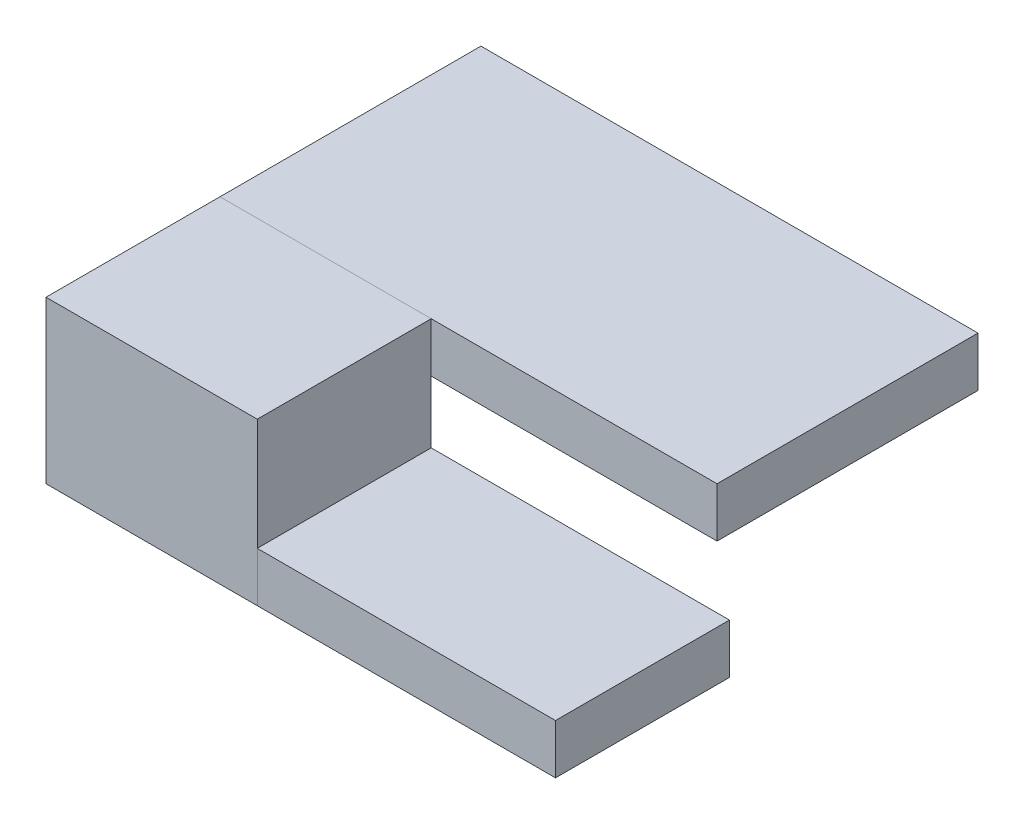
ISO-10303-21;
HEADER;
FILE_DESCRIPTION(('STEP AP214'),'2;1');
FILE_NAME('part.step','',(''),(''),'','','');
FILE_SCHEMA(('AUTOMOTIVE_DESIGN { 1 0 10303 214 1 1 1 1 }'));
ENDSEC;
DATA;
#1=APPLICATION_CONTEXT('core data for automotive mechanical design processes');
#2=APPLICATION_PROTOCOL_DEFINITION('international standard','automotive_design',2000,#1);
#3=PRODUCT_CONTEXT('',#1,'mechanical');
#4=PRODUCT('Part','Part','',(#3));
#5=PRODUCT_RELATED_PRODUCT_CATEGORY('part','',(#4));
#6=PRODUCT_DEFINITION_FORMATION('','',#4);
#7=PRODUCT_DEFINITION_CONTEXT('part definition',#1,'design');
#8=PRODUCT_DEFINITION('design','',#6,#7);
#9=PRODUCT_DEFINITION_SHAPE('','',#8);
#10=(LENGTH_UNIT() NAMED_UNIT(*) SI_UNIT(.MILLI.,.METRE.));
#11=(NAMED_UNIT(*) PLANE_ANGLE_UNIT() SI_UNIT($,.RADIAN.));
#12=(NAMED_UNIT(*) SI_UNIT($,.STERADIAN.) SOLID_ANGLE_UNIT());
#13=UNCERTAINTY_MEASURE_WITH_UNIT(LENGTH_MEASURE(1.E-05),#10,'distance_accuracy_value','');
#14=(GEOMETRIC_REPRESENTATION_CONTEXT(3) GLOBAL_UNCERTAINTY_ASSIGNED_CONTEXT((#13)) GLOBAL_UNIT_ASSIGNED_CONTEXT((#10,
#11,#12)) REPRESENTATION_CONTEXT('',''));
#15=CARTESIAN_POINT('',(0.,0.,0.));
#16=DIRECTION('',(0.,0.,1.));
#17=DIRECTION('',(1.,0.,0.));
#18=AXIS2_PLACEMENT_3D('',#15,#16,#17);
#19=CARTESIAN_POINT('',(40.,-4.,491.));
#20=DIRECTION('',(0.,0.,-1.));
#21=DIRECTION('',(-1.,0.,0.));
#22=AXIS2_PLACEMENT_3D('',#19,#20,#21);
#23=PLANE('',#22);
#24=DIRECTION('',(0.,-1.,0.));
#25=VECTOR('',#24,1.);
#26=CARTESIAN_POINT('',(0.,-4.,491.));
#27=LINE('',#26,#25);
#28=CARTESIAN_POINT('',(0.,0.,491.));
#29=VERTEX_POINT('',#28);
#30=CARTESIAN_POINT('',(0.,-4.,491.));
#31=VERTEX_POINT('',#30);
#32=EDGE_CURVE('E113',#29,#31,#27,.T.);
#33=ORIENTED_EDGE('',*,*,#32,.T.);
#34=DIRECTION('',(-1.,0.,0.));
#35=VECTOR('',#34,1.);
#36=CARTESIAN_POINT('',(40.,-4.,491.));
#37=LINE('',#36,#35);
#38=CARTESIAN_POINT('',(40.,-4.,491.));
#39=VERTEX_POINT('',#38);
#40=EDGE_CURVE('E12',#39,#31,#37,.T.);
#41=ORIENTED_EDGE('',*,*,#40,.F.);
#42=DIRECTION('',(0.,-1.,0.));
#43=VECTOR('',#42,1.);
#44=CARTESIAN_POINT('',(40.,-4.,491.));
#45=LINE('',#44,#43);
#46=CARTESIAN_POINT('',(40.,0.,491.));
#47=VERTEX_POINT('',#46);
#48=EDGE_CURVE('E101',#47,#39,#45,.T.);
#49=ORIENTED_EDGE('',*,*,#48,.F.);
#50=DIRECTION('',(-1.,0.,0.));
#51=VECTOR('',#50,1.);
#52=CARTESIAN_POINT('',(40.,0.,491.));
#53=LINE('',#52,#51);
#54=EDGE_CURVE('E109',#47,#29,#53,.T.);
#55=ORIENTED_EDGE('',*,*,#54,.T.);
#56=EDGE_LOOP('',(#33,#41,#49,#55));
#57=FACE_BOUND('',#56,.T.);
#58=ADVANCED_FACE('F50',(#57),#23,.F.);
#59=CARTESIAN_POINT('',(40.,-4.,470.));
#60=DIRECTION('',(0.,1.,0.));
#61=DIRECTION('',(0.,0.,1.));
#62=AXIS2_PLACEMENT_3D('',#59,#60,#61);
#63=PLANE('',#62);
#64=DIRECTION('',(0.,0.,-1.));
#65=VECTOR('',#64,1.);
#66=CARTESIAN_POINT('',(0.,-4.,470.));
#67=LINE('',#66,#65);
#68=CARTESIAN_POINT('',(0.,-4.,470.));
#69=VERTEX_POINT('',#68);
#70=EDGE_CURVE('E105',#31,#69,#67,.T.);
#71=ORIENTED_EDGE('',*,*,#70,.T.);
#72=DIRECTION('',(-1.,0.,0.));
#73=VECTOR('',#72,1.);
#74=CARTESIAN_POINT('',(40.,-4.,470.));
#75=LINE('',#74,#73);
#76=CARTESIAN_POINT('',(40.,-4.,470.));
#77=VERTEX_POINT('',#76);
#78=EDGE_CURVE('E58',#77,#69,#75,.T.);
#79=ORIENTED_EDGE('',*,*,#78,.F.);
#80=DIRECTION('',(0.,0.,-1.));
#81=VECTOR('',#80,1.);
#82=CARTESIAN_POINT('',(40.,-4.,470.));
#83=LINE('',#82,#81);
#84=EDGE_CURVE('E96',#39,#77,#83,.T.);
#85=ORIENTED_EDGE('',*,*,#84,.F.);
#86=ORIENTED_EDGE('',*,*,#40,.T.);
#87=EDGE_LOOP('',(#71,#79,#85,#86));
#88=FACE_BOUND('',#87,.T.);
#89=ADVANCED_FACE('F104',(#88),#63,.F.);
#90=CARTESIAN_POINT('',(40.,-4.,470.));
#91=DIRECTION('',(0.,0.,1.));
#92=DIRECTION('',(1.,0.,0.));
#93=AXIS2_PLACEMENT_3D('',#90,#91,#92);
#94=PLANE('',#93);
#95=DIRECTION('',(0.,1.,0.));
#96=VECTOR('',#95,1.);
#97=CARTESIAN_POINT('',(0.,-4.,470.));
#98=LINE('',#97,#96);
#99=CARTESIAN_POINT('',(0.,0.,470.));
#100=VERTEX_POINT('',#99);
#101=EDGE_CURVE('E83',#69,#100,#98,.T.);
#102=ORIENTED_EDGE('',*,*,#101,.T.);
#103=DIRECTION('',(-1.,0.,0.));
#104=VECTOR('',#103,1.);
#105=CARTESIAN_POINT('',(40.,0.,470.));
#106=LINE('',#105,#104);
#107=CARTESIAN_POINT('',(40.,0.,470.));
#108=VERTEX_POINT('',#107);
#109=EDGE_CURVE('E106',#108,#100,#106,.T.);
#110=ORIENTED_EDGE('',*,*,#109,.F.);
#111=DIRECTION('',(0.,1.,0.));
#112=VECTOR('',#111,1.);
#113=CARTESIAN_POINT('',(40.,-4.,470.));
#114=LINE('',#113,#112);
#115=EDGE_CURVE('E99',#77,#108,#114,.T.);
#116=ORIENTED_EDGE('',*,*,#115,.F.);
#117=ORIENTED_EDGE('',*,*,#78,.T.);
#118=EDGE_LOOP('',(#102,#110,#116,#117));
#119=FACE_BOUND('',#118,.T.);
#120=ADVANCED_FACE('F107',(#119),#94,.F.);
#121=CARTESIAN_POINT('',(40.,0.,470.));
#122=DIRECTION('',(0.,-1.,0.));
#123=DIRECTION('',(0.,0.,-1.));
#124=AXIS2_PLACEMENT_3D('',#121,#122,#123);
#125=PLANE('',#124);
#126=DIRECTION('',(0.,0.,1.));
#127=VECTOR('',#126,1.);
#128=CARTESIAN_POINT('',(0.,0.,470.));
#129=LINE('',#128,#127);
#130=EDGE_CURVE('E89',#100,#29,#129,.T.);
#131=ORIENTED_EDGE('',*,*,#130,.T.);
#132=ORIENTED_EDGE('',*,*,#54,.F.);
#133=DIRECTION('',(0.,0.,1.));
#134=VECTOR('',#133,1.);
#135=CARTESIAN_POINT('',(40.,0.,470.));
#136=LINE('',#135,#134);
#137=EDGE_CURVE('E66',#108,#47,#136,.T.);
#138=ORIENTED_EDGE('',*,*,#137,.F.);
#139=ORIENTED_EDGE('',*,*,#109,.T.);
#140=EDGE_LOOP('',(#131,#132,#138,#139));
#141=FACE_BOUND('',#140,.T.);
#142=ADVANCED_FACE('F120',(#141),#125,.F.);
#143=CARTESIAN_POINT('',(40.,0.,0.));
#144=DIRECTION('',(1.,0.,0.));
#145=DIRECTION('',(0.,0.,-1.));
#146=AXIS2_PLACEMENT_3D('',#143,#144,#145);
#147=PLANE('',#146);
#148=ORIENTED_EDGE('',*,*,#48,.T.);
#149=ORIENTED_EDGE('',*,*,#84,.T.);
#150=ORIENTED_EDGE('',*,*,#115,.T.);
#151=ORIENTED_EDGE('',*,*,#137,.T.);
#152=EDGE_LOOP('',(#148,#149,#150,#151));
#153=FACE_BOUND('',#152,.T.);
#154=ADVANCED_FACE('F97',(#153),#147,.T.);
#155=CARTESIAN_POINT('',(0.,0.,0.));
#156=DIRECTION('',(1.,0.,0.));
#157=DIRECTION('',(0.,0.,-1.));
#158=AXIS2_PLACEMENT_3D('',#155,#156,#157);
#159=PLANE('',#158);
#160=ORIENTED_EDGE('',*,*,#32,.F.);
#161=ORIENTED_EDGE('',*,*,#130,.F.);
#162=ORIENTED_EDGE('',*,*,#101,.F.);
#163=ORIENTED_EDGE('',*,*,#70,.F.);
#164=EDGE_LOOP('',(#160,#161,#162,#163));
#165=FACE_BOUND('',#164,.T.);
#166=ADVANCED_FACE('F123',(#165),#159,.F.);
#167=CLOSED_SHELL('',(#58,#89,#120,#142,#154,#166));
#168=MANIFOLD_SOLID_BREP('B2',#167);
#169=CARTESIAN_POINT('',(17.,-13.,505.));
#170=DIRECTION('',(0.,0.,-1.));
#171=DIRECTION('',(-1.,0.,0.));
#172=AXIS2_PLACEMENT_3D('',#169,#170,#171);
#173=PLANE('',#172);
#174=DIRECTION('',(0.,-1.,0.));
#175=VECTOR('',#174,1.);
#176=CARTESIAN_POINT('',(0.,-13.,505.));
#177=LINE('',#176,#175);
#178=CARTESIAN_POINT('',(0.,0.,505.));
#179=VERTEX_POINT('',#178);
#180=CARTESIAN_POINT('',(0.,-13.,505.));
#181=VERTEX_POINT('',#180);
#182=EDGE_CURVE('E246',#179,#181,#177,.T.);
#183=ORIENTED_EDGE('',*,*,#182,.T.);
#184=DIRECTION('',(-1.,0.,0.));
#185=VECTOR('',#184,1.);
#186=CARTESIAN_POINT('',(17.,-13.,505.));
#187=LINE('',#186,#185);
#188=CARTESIAN_POINT('',(17.,-13.,505.));
#189=VERTEX_POINT('',#188);
#190=EDGE_CURVE('E48',#189,#181,#187,.T.);
#191=ORIENTED_EDGE('',*,*,#190,.F.);
#192=DIRECTION('',(0.,-1.,0.));
#193=VECTOR('',#192,1.);
#194=CARTESIAN_POINT('',(17.,-13.,505.));
#195=LINE('',#194,#193);
#196=CARTESIAN_POINT('',(17.,0.,505.));
#197=VERTEX_POINT('',#196);
#198=EDGE_CURVE('E234',#197,#189,#195,.T.);
#199=ORIENTED_EDGE('',*,*,#198,.F.);
#200=DIRECTION('',(-1.,0.,0.));
#201=VECTOR('',#200,1.);
#202=CARTESIAN_POINT('',(17.,0.,505.));
#203=LINE('',#202,#201);
#204=EDGE_CURVE('E242',#197,#179,#203,.T.);
#205=ORIENTED_EDGE('',*,*,#204,.T.);
#206=EDGE_LOOP('',(#183,#191,#199,#205));
#207=FACE_BOUND('',#206,.T.);
#208=ADVANCED_FACE('F183',(#207),#173,.F.);
#209=CARTESIAN_POINT('',(17.,-13.,491.));
#210=DIRECTION('',(0.,1.,0.));
#211=DIRECTION('',(0.,0.,1.));
#212=AXIS2_PLACEMENT_3D('',#209,#210,#211);
#213=PLANE('',#212);
#214=DIRECTION('',(0.,0.,-1.));
#215=VECTOR('',#214,1.);
#216=CARTESIAN_POINT('',(0.,-13.,491.));
#217=LINE('',#216,#215);
#218=CARTESIAN_POINT('',(0.,-13.,491.));
#219=VERTEX_POINT('',#218);
#220=EDGE_CURVE('E238',#181,#219,#217,.T.);
#221=ORIENTED_EDGE('',*,*,#220,.T.);
#222=DIRECTION('',(-1.,0.,0.));
#223=VECTOR('',#222,1.);
#224=CARTESIAN_POINT('',(17.,-13.,491.));
#225=LINE('',#224,#223);
#226=CARTESIAN_POINT('',(17.,-13.,491.));
#227=VERTEX_POINT('',#226);
#228=EDGE_CURVE('E191',#227,#219,#225,.T.);
#229=ORIENTED_EDGE('',*,*,#228,.F.);
#230=DIRECTION('',(0.,0.,-1.));
#231=VECTOR('',#230,1.);
#232=CARTESIAN_POINT('',(17.,-13.,491.));
#233=LINE('',#232,#231);
#234=EDGE_CURVE('E229',#189,#227,#233,.T.);
#235=ORIENTED_EDGE('',*,*,#234,.F.);
#236=ORIENTED_EDGE('',*,*,#190,.T.);
#237=EDGE_LOOP('',(#221,#229,#235,#236));
#238=FACE_BOUND('',#237,.T.);
#239=ADVANCED_FACE('F237',(#238),#213,.F.);
#240=CARTESIAN_POINT('',(17.,-13.,491.));
#241=DIRECTION('',(0.,0.,1.));
#242=DIRECTION('',(1.,0.,0.));
#243=AXIS2_PLACEMENT_3D('',#240,#241,#242);
#244=PLANE('',#243);
#245=DIRECTION('',(0.,1.,0.));
#246=VECTOR('',#245,1.);
#247=CARTESIAN_POINT('',(0.,-13.,491.));
#248=LINE('',#247,#246);
#249=CARTESIAN_POINT('',(0.,0.,491.));
#250=VERTEX_POINT('',#249);
#251=EDGE_CURVE('E216',#219,#250,#248,.T.);
#252=ORIENTED_EDGE('',*,*,#251,.T.);
#253=DIRECTION('',(-1.,0.,0.));
#254=VECTOR('',#253,1.);
#255=CARTESIAN_POINT('',(17.,0.,491.));
#256=LINE('',#255,#254);
#257=CARTESIAN_POINT('',(17.,0.,491.));
#258=VERTEX_POINT('',#257);
#259=EDGE_CURVE('E239',#258,#250,#256,.T.);
#260=ORIENTED_EDGE('',*,*,#259,.F.);
#261=DIRECTION('',(0.,1.,0.));
#262=VECTOR('',#261,1.);
#263=CARTESIAN_POINT('',(17.,-13.,491.));
#264=LINE('',#263,#262);
#265=EDGE_CURVE('E232',#227,#258,#264,.T.);
#266=ORIENTED_EDGE('',*,*,#265,.F.);
#267=ORIENTED_EDGE('',*,*,#228,.T.);
#268=EDGE_LOOP('',(#252,#260,#266,#267));
#269=FACE_BOUND('',#268,.T.);
#270=ADVANCED_FACE('F240',(#269),#244,.F.);
#271=CARTESIAN_POINT('',(17.,0.,491.));
#272=DIRECTION('',(0.,-1.,0.));
#273=DIRECTION('',(0.,0.,-1.));
#274=AXIS2_PLACEMENT_3D('',#271,#272,#273);
#275=PLANE('',#274);
#276=DIRECTION('',(0.,0.,1.));
#277=VECTOR('',#276,1.);
#278=CARTESIAN_POINT('',(0.,0.,491.));
#279=LINE('',#278,#277);
#280=EDGE_CURVE('E222',#250,#179,#279,.T.);
#281=ORIENTED_EDGE('',*,*,#280,.T.);
#282=ORIENTED_EDGE('',*,*,#204,.F.);
#283=DIRECTION('',(0.,0.,1.));
#284=VECTOR('',#283,1.);
#285=CARTESIAN_POINT('',(17.,0.,491.));
#286=LINE('',#285,#284);
#287=EDGE_CURVE('E199',#258,#197,#286,.T.);
#288=ORIENTED_EDGE('',*,*,#287,.F.);
#289=ORIENTED_EDGE('',*,*,#259,.T.);
#290=EDGE_LOOP('',(#281,#282,#288,#289));
#291=FACE_BOUND('',#290,.T.);
#292=ADVANCED_FACE('F253',(#291),#275,.F.);
#293=CARTESIAN_POINT('',(17.,0.,0.));
#294=DIRECTION('',(1.,0.,0.));
#295=DIRECTION('',(0.,0.,-1.));
#296=AXIS2_PLACEMENT_3D('',#293,#294,#295);
#297=PLANE('',#296);
#298=ORIENTED_EDGE('',*,*,#198,.T.);
#299=ORIENTED_EDGE('',*,*,#234,.T.);
#300=ORIENTED_EDGE('',*,*,#265,.T.);
#301=ORIENTED_EDGE('',*,*,#287,.T.);
#302=EDGE_LOOP('',(#298,#299,#300,#301));
#303=FACE_BOUND('',#302,.T.);
#304=ADVANCED_FACE('F230',(#303),#297,.T.);
#305=CARTESIAN_POINT('',(0.,0.,0.));
#306=DIRECTION('',(1.,0.,0.));
#307=DIRECTION('',(0.,0.,-1.));
#308=AXIS2_PLACEMENT_3D('',#305,#306,#307);
#309=PLANE('',#308);
#310=ORIENTED_EDGE('',*,*,#182,.F.);
#311=ORIENTED_EDGE('',*,*,#280,.F.);
#312=ORIENTED_EDGE('',*,*,#251,.F.);
#313=ORIENTED_EDGE('',*,*,#220,.F.);
#314=EDGE_LOOP('',(#310,#311,#312,#313));
#315=FACE_BOUND('',#314,.T.);
#316=ADVANCED_FACE('F256',(#315),#309,.F.);
#317=CLOSED_SHELL('',(#208,#239,#270,#292,#304,#316));
#318=MANIFOLD_SOLID_BREP('B6',#317);
#319=CARTESIAN_POINT('',(41.,-13.,505.));
#320=DIRECTION('',(0.,0.,-1.));
#321=DIRECTION('',(-1.,0.,0.));
#322=AXIS2_PLACEMENT_3D('',#319,#320,#321);
#323=PLANE('',#322);
#324=DIRECTION('',(0.,-1.,0.));
#325=VECTOR('',#324,1.);
#326=CARTESIAN_POINT('',(17.,-13.,505.));
#327=LINE('',#326,#325);
#328=CARTESIAN_POINT('',(17.,-9.,505.));
#329=VERTEX_POINT('',#328);
#330=CARTESIAN_POINT('',(17.,-13.,505.));
#331=VERTEX_POINT('',#330);
#332=EDGE_CURVE('E370',#329,#331,#327,.T.);
#333=ORIENTED_EDGE('',*,*,#332,.T.);
#334=DIRECTION('',(-1.,0.,0.));
#335=VECTOR('',#334,1.);
#336=CARTESIAN_POINT('',(41.,-13.,505.));
#337=LINE('',#336,#335);
#338=CARTESIAN_POINT('',(41.,-13.,505.));
#339=VERTEX_POINT('',#338);
#340=EDGE_CURVE('E181',#339,#331,#337,.T.);
#341=ORIENTED_EDGE('',*,*,#340,.F.);
#342=DIRECTION('',(0.,-1.,0.));
#343=VECTOR('',#342,1.);
#344=CARTESIAN_POINT('',(41.,-13.,505.));
#345=LINE('',#344,#343);
#346=CARTESIAN_POINT('',(41.,-9.,505.));
#347=VERTEX_POINT('',#346);
#348=EDGE_CURVE('E358',#347,#339,#345,.T.);
#349=ORIENTED_EDGE('',*,*,#348,.F.);
#350=DIRECTION('',(-1.,0.,0.));
#351=VECTOR('',#350,1.);
#352=CARTESIAN_POINT('',(41.,-9.,505.));
#353=LINE('',#352,#351);
#354=EDGE_CURVE('E366',#347,#329,#353,.T.);
#355=ORIENTED_EDGE('',*,*,#354,.T.);
#356=EDGE_LOOP('',(#333,#341,#349,#355));
#357=FACE_BOUND('',#356,.T.);
#358=ADVANCED_FACE('F307',(#357),#323,.F.);
#359=CARTESIAN_POINT('',(41.,-13.,491.));
#360=DIRECTION('',(0.,1.,0.));
#361=DIRECTION('',(0.,0.,1.));
#362=AXIS2_PLACEMENT_3D('',#359,#360,#361);
#363=PLANE('',#362);
#364=DIRECTION('',(0.,0.,-1.));
#365=VECTOR('',#364,1.);
#366=CARTESIAN_POINT('',(17.,-13.,491.));
#367=LINE('',#366,#365);
#368=CARTESIAN_POINT('',(17.,-13.,491.));
#369=VERTEX_POINT('',#368);
#370=EDGE_CURVE('E362',#331,#369,#367,.T.);
#371=ORIENTED_EDGE('',*,*,#370,.T.);
#372=DIRECTION('',(-1.,0.,0.));
#373=VECTOR('',#372,1.);
#374=CARTESIAN_POINT('',(41.,-13.,491.));
#375=LINE('',#374,#373);
#376=CARTESIAN_POINT('',(41.,-13.,491.));
#377=VERTEX_POINT('',#376);
#378=EDGE_CURVE('E315',#377,#369,#375,.T.);
#379=ORIENTED_EDGE('',*,*,#378,.F.);
#380=DIRECTION('',(0.,0.,-1.));
#381=VECTOR('',#380,1.);
#382=CARTESIAN_POINT('',(41.,-13.,491.));
#383=LINE('',#382,#381);
#384=EDGE_CURVE('E353',#339,#377,#383,.T.);
#385=ORIENTED_EDGE('',*,*,#384,.F.);
#386=ORIENTED_EDGE('',*,*,#340,.T.);
#387=EDGE_LOOP('',(#371,#379,#385,#386));
#388=FACE_BOUND('',#387,.T.);
#389=ADVANCED_FACE('F361',(#388),#363,.F.);
#390=CARTESIAN_POINT('',(41.,-13.,491.));
#391=DIRECTION('',(0.,0.,1.));
#392=DIRECTION('',(1.,0.,0.));
#393=AXIS2_PLACEMENT_3D('',#390,#391,#392);
#394=PLANE('',#393);
#395=DIRECTION('',(0.,1.,0.));
#396=VECTOR('',#395,1.);
#397=CARTESIAN_POINT('',(17.,-13.,491.));
#398=LINE('',#397,#396);
#399=CARTESIAN_POINT('',(17.,-9.,491.));
#400=VERTEX_POINT('',#399);
#401=EDGE_CURVE('E340',#369,#400,#398,.T.);
#402=ORIENTED_EDGE('',*,*,#401,.T.);
#403=DIRECTION('',(-1.,0.,0.));
#404=VECTOR('',#403,1.);
#405=CARTESIAN_POINT('',(41.,-9.,491.));
#406=LINE('',#405,#404);
#407=CARTESIAN_POINT('',(41.,-9.,491.));
#408=VERTEX_POINT('',#407);
#409=EDGE_CURVE('E363',#408,#400,#406,.T.);
#410=ORIENTED_EDGE('',*,*,#409,.F.);
#411=DIRECTION('',(0.,1.,0.));
#412=VECTOR('',#411,1.);
#413=CARTESIAN_POINT('',(41.,-13.,491.));
#414=LINE('',#413,#412);
#415=EDGE_CURVE('E356',#377,#408,#414,.T.);
#416=ORIENTED_EDGE('',*,*,#415,.F.);
#417=ORIENTED_EDGE('',*,*,#378,.T.);
#418=EDGE_LOOP('',(#402,#410,#416,#417));
#419=FACE_BOUND('',#418,.T.);
#420=ADVANCED_FACE('F364',(#419),#394,.F.);
#421=CARTESIAN_POINT('',(41.,-9.,491.));
#422=DIRECTION('',(0.,-1.,0.));
#423=DIRECTION('',(0.,0.,-1.));
#424=AXIS2_PLACEMENT_3D('',#421,#422,#423);
#425=PLANE('',#424);
#426=DIRECTION('',(0.,0.,1.));
#427=VECTOR('',#426,1.);
#428=CARTESIAN_POINT('',(17.,-9.,491.));
#429=LINE('',#428,#427);
#430=EDGE_CURVE('E346',#400,#329,#429,.T.);
#431=ORIENTED_EDGE('',*,*,#430,.T.);
#432=ORIENTED_EDGE('',*,*,#354,.F.);
#433=DIRECTION('',(0.,0.,1.));
#434=VECTOR('',#433,1.);
#435=CARTESIAN_POINT('',(41.,-9.,491.));
#436=LINE('',#435,#434);
#437=EDGE_CURVE('E323',#408,#347,#436,.T.);
#438=ORIENTED_EDGE('',*,*,#437,.F.);
#439=ORIENTED_EDGE('',*,*,#409,.T.);
#440=EDGE_LOOP('',(#431,#432,#438,#439));
#441=FACE_BOUND('',#440,.T.);
#442=ADVANCED_FACE('F377',(#441),#425,.F.);
#443=CARTESIAN_POINT('',(41.,0.,0.));
#444=DIRECTION('',(1.,0.,0.));
#445=DIRECTION('',(0.,0.,-1.));
#446=AXIS2_PLACEMENT_3D('',#443,#444,#445);
#447=PLANE('',#446);
#448=ORIENTED_EDGE('',*,*,#348,.T.);
#449=ORIENTED_EDGE('',*,*,#384,.T.);
#450=ORIENTED_EDGE('',*,*,#415,.T.);
#451=ORIENTED_EDGE('',*,*,#437,.T.);
#452=EDGE_LOOP('',(#448,#449,#450,#451));
#453=FACE_BOUND('',#452,.T.);
#454=ADVANCED_FACE('F354',(#453),#447,.T.);
#455=CARTESIAN_POINT('',(17.,0.,0.));
#456=DIRECTION('',(1.,0.,0.));
#457=DIRECTION('',(0.,0.,-1.));
#458=AXIS2_PLACEMENT_3D('',#455,#456,#457);
#459=PLANE('',#458);
#460=ORIENTED_EDGE('',*,*,#332,.F.);
#461=ORIENTED_EDGE('',*,*,#430,.F.);
#462=ORIENTED_EDGE('',*,*,#401,.F.);
#463=ORIENTED_EDGE('',*,*,#370,.F.);
#464=EDGE_LOOP('',(#460,#461,#462,#463));
#465=FACE_BOUND('',#464,.T.);
#466=ADVANCED_FACE('F380',(#465),#459,.F.);
#467=CLOSED_SHELL('',(#358,#389,#420,#442,#454,#466));
#468=MANIFOLD_SOLID_BREP('B42',#467);
#469=ADVANCED_BREP_SHAPE_REPRESENTATION('',(#18,#168,#318,#468),#14);
#470=SHAPE_DEFINITION_REPRESENTATION(#9,#469);
ENDSEC;
END-ISO-10303-21;
